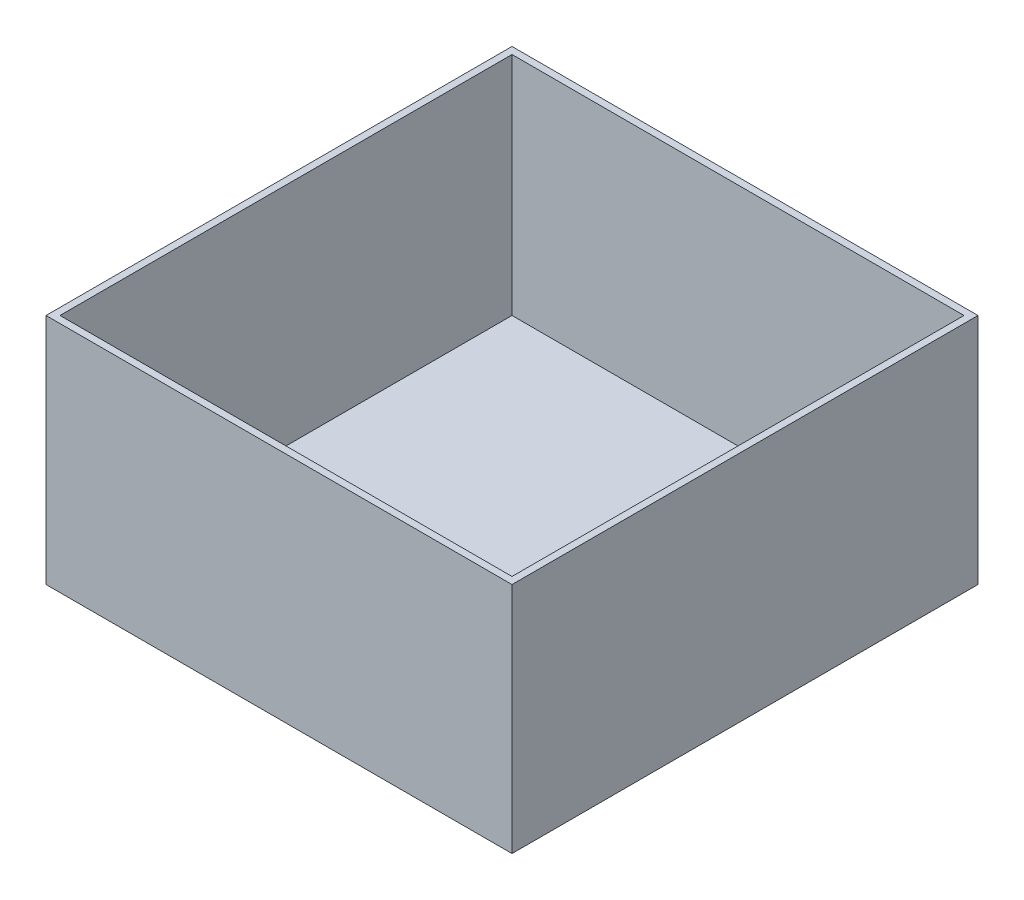
ISO-10303-21;
HEADER;
FILE_DESCRIPTION(('STEP AP214'),'2;1');
FILE_NAME('part.step','',(''),(''),'','','');
FILE_SCHEMA(('AUTOMOTIVE_DESIGN { 1 0 10303 214 1 1 1 1 }'));
ENDSEC;
DATA;
#1=APPLICATION_CONTEXT('core data for automotive mechanical design processes');
#2=APPLICATION_PROTOCOL_DEFINITION('international standard','automotive_design',2000,#1);
#3=PRODUCT_CONTEXT('',#1,'mechanical');
#4=PRODUCT('Part','Part','',(#3));
#5=PRODUCT_RELATED_PRODUCT_CATEGORY('part','',(#4));
#6=PRODUCT_DEFINITION_FORMATION('','',#4);
#7=PRODUCT_DEFINITION_CONTEXT('part definition',#1,'design');
#8=PRODUCT_DEFINITION('design','',#6,#7);
#9=PRODUCT_DEFINITION_SHAPE('','',#8);
#10=(LENGTH_UNIT() NAMED_UNIT(*) SI_UNIT(.MILLI.,.METRE.));
#11=(NAMED_UNIT(*) PLANE_ANGLE_UNIT() SI_UNIT($,.RADIAN.));
#12=(NAMED_UNIT(*) SI_UNIT($,.STERADIAN.) SOLID_ANGLE_UNIT());
#13=UNCERTAINTY_MEASURE_WITH_UNIT(LENGTH_MEASURE(1.E-05),#10,'distance_accuracy_value','');
#14=(GEOMETRIC_REPRESENTATION_CONTEXT(3) GLOBAL_UNCERTAINTY_ASSIGNED_CONTEXT((#13)) GLOBAL_UNIT_ASSIGNED_CONTEXT((#10,
#11,#12)) REPRESENTATION_CONTEXT('',''));
#15=CARTESIAN_POINT('',(0.,0.,0.));
#16=DIRECTION('',(0.,0.,1.));
#17=DIRECTION('',(1.,0.,0.));
#18=AXIS2_PLACEMENT_3D('',#15,#16,#17);
#19=CARTESIAN_POINT('',(100.,100.,-100.));
#20=DIRECTION('',(0.,0.,1.));
#21=DIRECTION('',(1.,0.,0.));
#22=AXIS2_PLACEMENT_3D('',#19,#20,#21);
#23=PLANE('',#22);
#24=DIRECTION('',(-1.,0.,0.));
#25=VECTOR('',#24,1.);
#26=CARTESIAN_POINT('',(100.,0.,-100.));
#27=LINE('',#26,#25);
#28=CARTESIAN_POINT('',(100.,0.,-100.));
#29=VERTEX_POINT('',#28);
#30=CARTESIAN_POINT('',(-100.,0.,-100.));
#31=VERTEX_POINT('',#30);
#32=EDGE_CURVE('E145',#29,#31,#27,.T.);
#33=ORIENTED_EDGE('',*,*,#32,.T.);
#34=DIRECTION('',(0.,-1.,0.));
#35=VECTOR('',#34,1.);
#36=CARTESIAN_POINT('',(-100.,100.,-100.));
#37=LINE('',#36,#35);
#38=CARTESIAN_POINT('',(-100.,100.,-100.));
#39=VERTEX_POINT('',#38);
#40=EDGE_CURVE('E11',#39,#31,#37,.T.);
#41=ORIENTED_EDGE('',*,*,#40,.F.);
#42=DIRECTION('',(-1.,0.,0.));
#43=VECTOR('',#42,1.);
#44=CARTESIAN_POINT('',(100.,100.,-100.));
#45=LINE('',#44,#43);
#46=CARTESIAN_POINT('',(100.,100.,-100.));
#47=VERTEX_POINT('',#46);
#48=EDGE_CURVE('E149',#47,#39,#45,.T.);
#49=ORIENTED_EDGE('',*,*,#48,.F.);
#50=DIRECTION('',(0.,-1.,0.));
#51=VECTOR('',#50,1.);
#52=CARTESIAN_POINT('',(100.,100.,-100.));
#53=LINE('',#52,#51);
#54=EDGE_CURVE('E155',#47,#29,#53,.T.);
#55=ORIENTED_EDGE('',*,*,#54,.T.);
#56=EDGE_LOOP('',(#33,#41,#49,#55));
#57=FACE_BOUND('',#56,.T.);
#58=ADVANCED_FACE('F37',(#57),#23,.F.);
#59=CARTESIAN_POINT('',(-100.,100.,-100.));
#60=DIRECTION('',(1.,0.,0.));
#61=DIRECTION('',(0.,0.,-1.));
#62=AXIS2_PLACEMENT_3D('',#59,#60,#61);
#63=PLANE('',#62);
#64=DIRECTION('',(0.,0.,1.));
#65=VECTOR('',#64,1.);
#66=CARTESIAN_POINT('',(-100.,0.,-100.));
#67=LINE('',#66,#65);
#68=CARTESIAN_POINT('',(-100.,0.,100.));
#69=VERTEX_POINT('',#68);
#70=EDGE_CURVE('E158',#31,#69,#67,.T.);
#71=ORIENTED_EDGE('',*,*,#70,.T.);
#72=DIRECTION('',(0.,-1.,0.));
#73=VECTOR('',#72,1.);
#74=CARTESIAN_POINT('',(-100.,100.,100.));
#75=LINE('',#74,#73);
#76=CARTESIAN_POINT('',(-100.,100.,100.));
#77=VERTEX_POINT('',#76);
#78=EDGE_CURVE('E44',#77,#69,#75,.T.);
#79=ORIENTED_EDGE('',*,*,#78,.F.);
#80=DIRECTION('',(0.,0.,1.));
#81=VECTOR('',#80,1.);
#82=CARTESIAN_POINT('',(-100.,100.,-100.));
#83=LINE('',#82,#81);
#84=EDGE_CURVE('E88',#39,#77,#83,.T.);
#85=ORIENTED_EDGE('',*,*,#84,.F.);
#86=ORIENTED_EDGE('',*,*,#40,.T.);
#87=EDGE_LOOP('',(#71,#79,#85,#86));
#88=FACE_BOUND('',#87,.T.);
#89=ADVANCED_FACE('F187',(#88),#63,.F.);
#90=CARTESIAN_POINT('',(-100.,100.,100.));
#91=DIRECTION('',(0.,0.,-1.));
#92=DIRECTION('',(-1.,0.,0.));
#93=AXIS2_PLACEMENT_3D('',#90,#91,#92);
#94=PLANE('',#93);
#95=DIRECTION('',(1.,0.,0.));
#96=VECTOR('',#95,1.);
#97=CARTESIAN_POINT('',(-100.,0.,100.));
#98=LINE('',#97,#96);
#99=CARTESIAN_POINT('',(100.,0.,100.));
#100=VERTEX_POINT('',#99);
#101=EDGE_CURVE('E160',#69,#100,#98,.T.);
#102=ORIENTED_EDGE('',*,*,#101,.T.);
#103=DIRECTION('',(0.,-1.,0.));
#104=VECTOR('',#103,1.);
#105=CARTESIAN_POINT('',(100.,100.,100.));
#106=LINE('',#105,#104);
#107=CARTESIAN_POINT('',(100.,100.,100.));
#108=VERTEX_POINT('',#107);
#109=EDGE_CURVE('E164',#108,#100,#106,.T.);
#110=ORIENTED_EDGE('',*,*,#109,.F.);
#111=DIRECTION('',(1.,0.,0.));
#112=VECTOR('',#111,1.);
#113=CARTESIAN_POINT('',(-100.,100.,100.));
#114=LINE('',#113,#112);
#115=EDGE_CURVE('E152',#77,#108,#114,.T.);
#116=ORIENTED_EDGE('',*,*,#115,.F.);
#117=ORIENTED_EDGE('',*,*,#78,.T.);
#118=EDGE_LOOP('',(#102,#110,#116,#117));
#119=FACE_BOUND('',#118,.T.);
#120=ADVANCED_FACE('F169',(#119),#94,.F.);
#121=CARTESIAN_POINT('',(100.,100.,100.));
#122=DIRECTION('',(-1.,0.,0.));
#123=DIRECTION('',(0.,0.,1.));
#124=AXIS2_PLACEMENT_3D('',#121,#122,#123);
#125=PLANE('',#124);
#126=DIRECTION('',(0.,0.,-1.));
#127=VECTOR('',#126,1.);
#128=CARTESIAN_POINT('',(100.,0.,100.));
#129=LINE('',#128,#127);
#130=EDGE_CURVE('E81',#100,#29,#129,.T.);
#131=ORIENTED_EDGE('',*,*,#130,.T.);
#132=ORIENTED_EDGE('',*,*,#54,.F.);
#133=DIRECTION('',(0.,0.,-1.));
#134=VECTOR('',#133,1.);
#135=CARTESIAN_POINT('',(100.,100.,100.));
#136=LINE('',#135,#134);
#137=EDGE_CURVE('E60',#108,#47,#136,.T.);
#138=ORIENTED_EDGE('',*,*,#137,.F.);
#139=ORIENTED_EDGE('',*,*,#109,.T.);
#140=EDGE_LOOP('',(#131,#132,#138,#139));
#141=FACE_BOUND('',#140,.T.);
#142=ADVANCED_FACE('F177',(#141),#125,.F.);
#143=CARTESIAN_POINT('',(0.,100.,0.));
#144=DIRECTION('',(0.,1.,0.));
#145=DIRECTION('',(0.,0.,1.));
#146=AXIS2_PLACEMENT_3D('',#143,#144,#145);
#147=PLANE('',#146);
#148=DIRECTION('',(0.,0.,-1.));
#149=VECTOR('',#148,1.);
#150=CARTESIAN_POINT('',(97.,100.,97.));
#151=LINE('',#150,#149);
#152=CARTESIAN_POINT('',(97.,100.,97.));
#153=VERTEX_POINT('',#152);
#154=CARTESIAN_POINT('',(97.,100.,-97.));
#155=VERTEX_POINT('',#154);
#156=EDGE_CURVE('E51',#153,#155,#151,.T.);
#157=ORIENTED_EDGE('',*,*,#156,.F.);
#158=DIRECTION('',(1.,0.,0.));
#159=VECTOR('',#158,1.);
#160=CARTESIAN_POINT('',(-97.,100.,97.));
#161=LINE('',#160,#159);
#162=CARTESIAN_POINT('',(-97.,100.,97.));
#163=VERTEX_POINT('',#162);
#164=EDGE_CURVE('E130',#163,#153,#161,.T.);
#165=ORIENTED_EDGE('',*,*,#164,.F.);
#166=DIRECTION('',(0.,0.,1.));
#167=VECTOR('',#166,1.);
#168=CARTESIAN_POINT('',(-97.,100.,-97.));
#169=LINE('',#168,#167);
#170=CARTESIAN_POINT('',(-97.,100.,-97.));
#171=VERTEX_POINT('',#170);
#172=EDGE_CURVE('E133',#171,#163,#169,.T.);
#173=ORIENTED_EDGE('',*,*,#172,.F.);
#174=DIRECTION('',(-1.,0.,0.));
#175=VECTOR('',#174,1.);
#176=CARTESIAN_POINT('',(97.,100.,-97.));
#177=LINE('',#176,#175);
#178=EDGE_CURVE('E139',#155,#171,#177,.T.);
#179=ORIENTED_EDGE('',*,*,#178,.F.);
#180=EDGE_LOOP('',(#157,#165,#173,#179));
#181=FACE_BOUND('',#180,.T.);
#182=ORIENTED_EDGE('',*,*,#48,.T.);
#183=ORIENTED_EDGE('',*,*,#84,.T.);
#184=ORIENTED_EDGE('',*,*,#115,.T.);
#185=ORIENTED_EDGE('',*,*,#137,.T.);
#186=EDGE_LOOP('',(#182,#183,#184,#185));
#187=FACE_BOUND('',#186,.T.);
#188=ADVANCED_FACE('F179',(#181,#187),#147,.T.);
#189=CARTESIAN_POINT('',(0.,0.,0.));
#190=DIRECTION('',(0.,1.,0.));
#191=DIRECTION('',(0.,0.,1.));
#192=AXIS2_PLACEMENT_3D('',#189,#190,#191);
#193=PLANE('',#192);
#194=ORIENTED_EDGE('',*,*,#32,.F.);
#195=ORIENTED_EDGE('',*,*,#130,.F.);
#196=ORIENTED_EDGE('',*,*,#101,.F.);
#197=ORIENTED_EDGE('',*,*,#70,.F.);
#198=EDGE_LOOP('',(#194,#195,#196,#197));
#199=FACE_BOUND('',#198,.T.);
#200=ADVANCED_FACE('F173',(#199),#193,.F.);
#201=CARTESIAN_POINT('',(97.,3.,97.));
#202=DIRECTION('',(1.,0.,0.));
#203=DIRECTION('',(0.,0.,-1.));
#204=AXIS2_PLACEMENT_3D('',#201,#202,#203);
#205=PLANE('',#204);
#206=ORIENTED_EDGE('',*,*,#156,.T.);
#207=DIRECTION('',(0.,1.,0.));
#208=VECTOR('',#207,1.);
#209=CARTESIAN_POINT('',(97.,3.,-97.));
#210=LINE('',#209,#208);
#211=CARTESIAN_POINT('',(97.,3.,-97.));
#212=VERTEX_POINT('',#211);
#213=EDGE_CURVE('E108',#212,#155,#210,.T.);
#214=ORIENTED_EDGE('',*,*,#213,.F.);
#215=DIRECTION('',(0.,0.,-1.));
#216=VECTOR('',#215,1.);
#217=CARTESIAN_POINT('',(97.,3.,97.));
#218=LINE('',#217,#216);
#219=CARTESIAN_POINT('',(97.,3.,97.));
#220=VERTEX_POINT('',#219);
#221=EDGE_CURVE('E112',#220,#212,#218,.T.);
#222=ORIENTED_EDGE('',*,*,#221,.F.);
#223=DIRECTION('',(0.,1.,0.));
#224=VECTOR('',#223,1.);
#225=CARTESIAN_POINT('',(97.,3.,97.));
#226=LINE('',#225,#224);
#227=EDGE_CURVE('E143',#220,#153,#226,.T.);
#228=ORIENTED_EDGE('',*,*,#227,.T.);
#229=EDGE_LOOP('',(#206,#214,#222,#228));
#230=FACE_BOUND('',#229,.T.);
#231=ADVANCED_FACE('F110',(#230),#205,.F.);
#232=CARTESIAN_POINT('',(-97.,3.,97.));
#233=DIRECTION('',(0.,0.,1.));
#234=DIRECTION('',(1.,0.,0.));
#235=AXIS2_PLACEMENT_3D('',#232,#233,#234);
#236=PLANE('',#235);
#237=ORIENTED_EDGE('',*,*,#164,.T.);
#238=ORIENTED_EDGE('',*,*,#227,.F.);
#239=DIRECTION('',(1.,0.,0.));
#240=VECTOR('',#239,1.);
#241=CARTESIAN_POINT('',(-97.,3.,97.));
#242=LINE('',#241,#240);
#243=CARTESIAN_POINT('',(-97.,3.,97.));
#244=VERTEX_POINT('',#243);
#245=EDGE_CURVE('E118',#244,#220,#242,.T.);
#246=ORIENTED_EDGE('',*,*,#245,.F.);
#247=DIRECTION('',(0.,1.,0.));
#248=VECTOR('',#247,1.);
#249=CARTESIAN_POINT('',(-97.,3.,97.));
#250=LINE('',#249,#248);
#251=EDGE_CURVE('E146',#244,#163,#250,.T.);
#252=ORIENTED_EDGE('',*,*,#251,.T.);
#253=EDGE_LOOP('',(#237,#238,#246,#252));
#254=FACE_BOUND('',#253,.T.);
#255=ADVANCED_FACE('F226',(#254),#236,.F.);
#256=CARTESIAN_POINT('',(-97.,3.,-97.));
#257=DIRECTION('',(-1.,0.,0.));
#258=DIRECTION('',(0.,0.,1.));
#259=AXIS2_PLACEMENT_3D('',#256,#257,#258);
#260=PLANE('',#259);
#261=ORIENTED_EDGE('',*,*,#172,.T.);
#262=ORIENTED_EDGE('',*,*,#251,.F.);
#263=DIRECTION('',(0.,0.,1.));
#264=VECTOR('',#263,1.);
#265=CARTESIAN_POINT('',(-97.,3.,-97.));
#266=LINE('',#265,#264);
#267=CARTESIAN_POINT('',(-97.,3.,-97.));
#268=VERTEX_POINT('',#267);
#269=EDGE_CURVE('E126',#268,#244,#266,.T.);
#270=ORIENTED_EDGE('',*,*,#269,.F.);
#271=DIRECTION('',(0.,1.,0.));
#272=VECTOR('',#271,1.);
#273=CARTESIAN_POINT('',(-97.,3.,-97.));
#274=LINE('',#273,#272);
#275=EDGE_CURVE('E117',#268,#171,#274,.T.);
#276=ORIENTED_EDGE('',*,*,#275,.T.);
#277=EDGE_LOOP('',(#261,#262,#270,#276));
#278=FACE_BOUND('',#277,.T.);
#279=ADVANCED_FACE('F235',(#278),#260,.F.);
#280=CARTESIAN_POINT('',(97.,3.,-97.));
#281=DIRECTION('',(0.,0.,-1.));
#282=DIRECTION('',(-1.,0.,0.));
#283=AXIS2_PLACEMENT_3D('',#280,#281,#282);
#284=PLANE('',#283);
#285=ORIENTED_EDGE('',*,*,#178,.T.);
#286=ORIENTED_EDGE('',*,*,#275,.F.);
#287=DIRECTION('',(-1.,0.,0.));
#288=VECTOR('',#287,1.);
#289=CARTESIAN_POINT('',(97.,3.,-97.));
#290=LINE('',#289,#288);
#291=EDGE_CURVE('E121',#212,#268,#290,.T.);
#292=ORIENTED_EDGE('',*,*,#291,.F.);
#293=ORIENTED_EDGE('',*,*,#213,.T.);
#294=EDGE_LOOP('',(#285,#286,#292,#293));
#295=FACE_BOUND('',#294,.T.);
#296=ADVANCED_FACE('F122',(#295),#284,.F.);
#297=CARTESIAN_POINT('',(0.,3.,0.));
#298=DIRECTION('',(0.,1.,0.));
#299=DIRECTION('',(0.,0.,1.));
#300=AXIS2_PLACEMENT_3D('',#297,#298,#299);
#301=PLANE('',#300);
#302=ORIENTED_EDGE('',*,*,#221,.T.);
#303=ORIENTED_EDGE('',*,*,#291,.T.);
#304=ORIENTED_EDGE('',*,*,#269,.T.);
#305=ORIENTED_EDGE('',*,*,#245,.T.);
#306=EDGE_LOOP('',(#302,#303,#304,#305));
#307=FACE_BOUND('',#306,.T.);
#308=ADVANCED_FACE('F128',(#307),#301,.T.);
#309=CLOSED_SHELL('',(#58,#89,#120,#142,#188,#200,#231,#255,#279,#296,#308));
#310=MANIFOLD_SOLID_BREP('B2',#309);
#311=ADVANCED_BREP_SHAPE_REPRESENTATION('',(#18,#310),#14);
#312=SHAPE_DEFINITION_REPRESENTATION(#9,#311);
ENDSEC;
END-ISO-10303-21;
